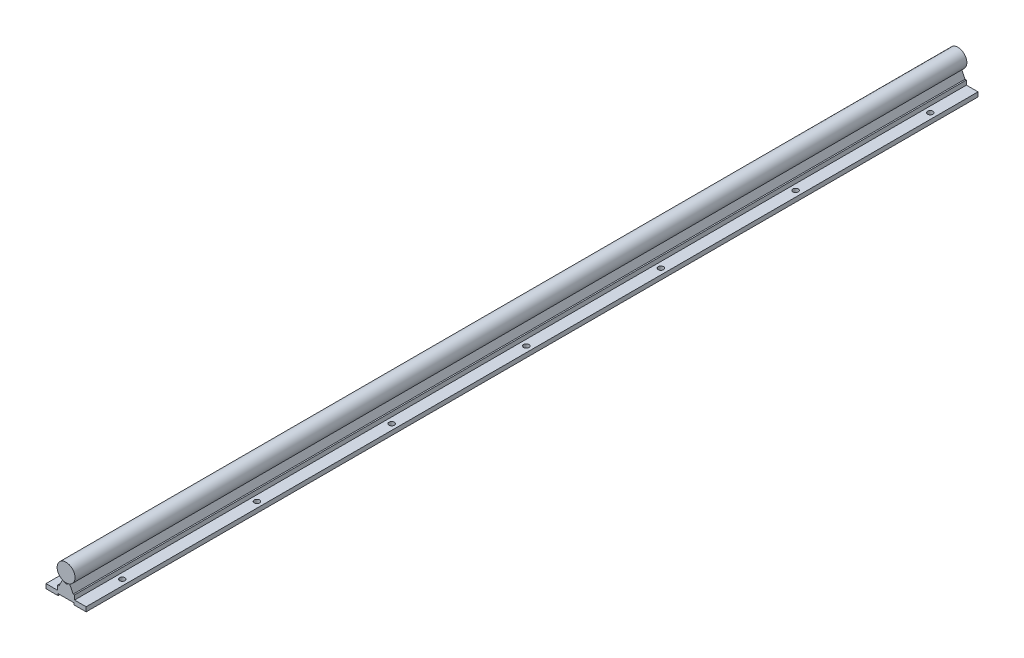
ISO-10303-21;
HEADER;
FILE_DESCRIPTION(('STEP AP214'),'2;1');
FILE_NAME('part.step','',(''),(''),'','','');
FILE_SCHEMA(('AUTOMOTIVE_DESIGN { 1 0 10303 214 1 1 1 1 }'));
ENDSEC;
DATA;
#1=APPLICATION_CONTEXT('core data for automotive mechanical design processes');
#2=APPLICATION_PROTOCOL_DEFINITION('international standard','automotive_design',2000,#1);
#3=PRODUCT_CONTEXT('',#1,'mechanical');
#4=PRODUCT('Part','Part','',(#3));
#5=PRODUCT_RELATED_PRODUCT_CATEGORY('part','',(#4));
#6=PRODUCT_DEFINITION_FORMATION('','',#4);
#7=PRODUCT_DEFINITION_CONTEXT('part definition',#1,'design');
#8=PRODUCT_DEFINITION('design','',#6,#7);
#9=PRODUCT_DEFINITION_SHAPE('','',#8);
#10=(LENGTH_UNIT() NAMED_UNIT(*) SI_UNIT(.MILLI.,.METRE.));
#11=(NAMED_UNIT(*) PLANE_ANGLE_UNIT() SI_UNIT($,.RADIAN.));
#12=(NAMED_UNIT(*) SI_UNIT($,.STERADIAN.) SOLID_ANGLE_UNIT());
#13=UNCERTAINTY_MEASURE_WITH_UNIT(LENGTH_MEASURE(1.E-05),#10,'distance_accuracy_value','');
#14=(GEOMETRIC_REPRESENTATION_CONTEXT(3) GLOBAL_UNCERTAINTY_ASSIGNED_CONTEXT((#13)) GLOBAL_UNIT_ASSIGNED_CONTEXT((#10,
#11,#12)) REPRESENTATION_CONTEXT('',''));
#15=CARTESIAN_POINT('',(0.,0.,0.));
#16=DIRECTION('',(0.,0.,1.));
#17=DIRECTION('',(1.,0.,0.));
#18=AXIS2_PLACEMENT_3D('',#15,#16,#17);
#19=CARTESIAN_POINT('',(0.,-27.,-1000.));
#20=DIRECTION('',(0.,-1.,0.));
#21=DIRECTION('',(0.,0.,-1.));
#22=AXIS2_PLACEMENT_3D('',#19,#20,#21);
#23=PLANE('',#22);
#24=CARTESIAN_POINT('',(-15.999999999998,-27.,-802.));
#25=DIRECTION('',(0.,-1.,0.));
#26=DIRECTION('',(0.,0.,-1.));
#27=AXIS2_PLACEMENT_3D('',#24,#25,#26);
#28=CIRCLE('',#27,3.);
#29=CARTESIAN_POINT('',(-15.999999999998,-27.,-805.));
#30=VERTEX_POINT('',#29);
#31=EDGE_CURVE('E758',#30,#30,#28,.F.);
#32=ORIENTED_EDGE('',*,*,#31,.T.);
#33=EDGE_LOOP('',(#32));
#34=FACE_BOUND('',#33,.T.);
#35=CARTESIAN_POINT('',(-15.9999999999991,-27.,-500.));
#36=DIRECTION('',(0.,-1.,0.));
#37=DIRECTION('',(0.,0.,-1.));
#38=AXIS2_PLACEMENT_3D('',#35,#36,#37);
#39=CIRCLE('',#38,3.);
#40=CARTESIAN_POINT('',(-15.9999999999991,-27.,-503.));
#41=VERTEX_POINT('',#40);
#42=EDGE_CURVE('E769',#41,#41,#39,.F.);
#43=ORIENTED_EDGE('',*,*,#42,.T.);
#44=EDGE_LOOP('',(#43));
#45=FACE_BOUND('',#44,.T.);
#46=CARTESIAN_POINT('',(-16.0000000000001,-27.,-198.));
#47=DIRECTION('',(0.,-1.,0.));
#48=DIRECTION('',(0.,0.,-1.));
#49=AXIS2_PLACEMENT_3D('',#46,#47,#48);
#50=CIRCLE('',#49,3.);
#51=CARTESIAN_POINT('',(-16.0000000000001,-27.,-201.));
#52=VERTEX_POINT('',#51);
#53=EDGE_CURVE('E781',#52,#52,#50,.F.);
#54=ORIENTED_EDGE('',*,*,#53,.T.);
#55=EDGE_LOOP('',(#54));
#56=FACE_BOUND('',#55,.T.);
#57=DIRECTION('',(1.,0.,0.));
#58=VECTOR('',#57,1.);
#59=CARTESIAN_POINT('',(0.,-27.,0.));
#60=LINE('',#59,#58);
#61=CARTESIAN_POINT('',(-22.5,-27.,0.));
#62=VERTEX_POINT('',#61);
#63=CARTESIAN_POINT('',(-9.,-27.,0.));
#64=VERTEX_POINT('',#63);
#65=EDGE_CURVE('E269',#62,#64,#60,.T.);
#66=ORIENTED_EDGE('',*,*,#65,.F.);
#67=DIRECTION('',(0.,0.,1.));
#68=VECTOR('',#67,1.);
#69=CARTESIAN_POINT('',(-22.5,-27.,-1000.));
#70=LINE('',#69,#68);
#71=CARTESIAN_POINT('',(-22.5,-27.,-1000.));
#72=VERTEX_POINT('',#71);
#73=EDGE_CURVE('E310',#72,#62,#70,.T.);
#74=ORIENTED_EDGE('',*,*,#73,.F.);
#75=DIRECTION('',(1.,0.,0.));
#76=VECTOR('',#75,1.);
#77=CARTESIAN_POINT('',(0.,-27.,-1000.));
#78=LINE('',#77,#76);
#79=CARTESIAN_POINT('',(-9.,-27.,-1000.));
#80=VERTEX_POINT('',#79);
#81=EDGE_CURVE('E382',#72,#80,#78,.T.);
#82=ORIENTED_EDGE('',*,*,#81,.T.);
#83=DIRECTION('',(0.,0.,1.));
#84=VECTOR('',#83,1.);
#85=CARTESIAN_POINT('',(-9.,-27.,-1000.));
#86=LINE('',#85,#84);
#87=EDGE_CURVE('E308',#80,#64,#86,.T.);
#88=ORIENTED_EDGE('',*,*,#87,.T.);
#89=EDGE_LOOP('',(#66,#74,#82,#88));
#90=FACE_BOUND('',#89,.T.);
#91=CARTESIAN_POINT('',(-16.0000000000001,-27.,-47.));
#92=DIRECTION('',(0.,-1.,0.));
#93=DIRECTION('',(0.,0.,-1.));
#94=AXIS2_PLACEMENT_3D('',#91,#92,#93);
#95=CIRCLE('',#94,2.99999999999999);
#96=CARTESIAN_POINT('',(-16.0000000000001,-27.,-50.));
#97=VERTEX_POINT('',#96);
#98=EDGE_CURVE('E786',#97,#97,#95,.F.);
#99=ORIENTED_EDGE('',*,*,#98,.T.);
#100=EDGE_LOOP('',(#99));
#101=FACE_BOUND('',#100,.T.);
#102=CARTESIAN_POINT('',(-15.9999999999996,-27.,-349.));
#103=DIRECTION('',(0.,-1.,0.));
#104=DIRECTION('',(0.,0.,-1.));
#105=AXIS2_PLACEMENT_3D('',#102,#103,#104);
#106=CIRCLE('',#105,3.);
#107=CARTESIAN_POINT('',(-15.9999999999996,-27.,-352.));
#108=VERTEX_POINT('',#107);
#109=EDGE_CURVE('E775',#108,#108,#106,.F.);
#110=ORIENTED_EDGE('',*,*,#109,.T.);
#111=EDGE_LOOP('',(#110));
#112=FACE_BOUND('',#111,.T.);
#113=CARTESIAN_POINT('',(-15.9999999999985,-27.,-651.));
#114=DIRECTION('',(0.,-1.,0.));
#115=DIRECTION('',(0.,0.,-1.));
#116=AXIS2_PLACEMENT_3D('',#113,#114,#115);
#117=CIRCLE('',#116,3.);
#118=CARTESIAN_POINT('',(-15.9999999999985,-27.,-654.));
#119=VERTEX_POINT('',#118);
#120=EDGE_CURVE('E763',#119,#119,#117,.F.);
#121=ORIENTED_EDGE('',*,*,#120,.T.);
#122=EDGE_LOOP('',(#121));
#123=FACE_BOUND('',#122,.T.);
#124=CARTESIAN_POINT('',(-15.9999999999975,-27.,-953.));
#125=DIRECTION('',(0.,-1.,0.));
#126=DIRECTION('',(0.,0.,-1.));
#127=AXIS2_PLACEMENT_3D('',#124,#125,#126);
#128=CIRCLE('',#127,3.);
#129=CARTESIAN_POINT('',(-15.9999999999975,-27.,-956.));
#130=VERTEX_POINT('',#129);
#131=EDGE_CURVE('E747',#130,#130,#128,.F.);
#132=ORIENTED_EDGE('',*,*,#131,.T.);
#133=EDGE_LOOP('',(#132));
#134=FACE_BOUND('',#133,.T.);
#135=ADVANCED_FACE('F100',(#34,#45,#56,#90,#101,#112,#123,#134),#23,.T.);
#136=CARTESIAN_POINT('',(0.,-22.,-1000.));
#137=DIRECTION('',(0.,-1.,0.));
#138=DIRECTION('',(1.,0.,0.));
#139=AXIS2_PLACEMENT_3D('',#136,#137,#138);
#140=PLANE('',#139);
#141=CARTESIAN_POINT('',(-15.999999999998,-22.,-802.));
#142=DIRECTION('',(0.,-1.,0.));
#143=DIRECTION('',(1.,0.,0.));
#144=AXIS2_PLACEMENT_3D('',#141,#142,#143);
#145=CIRCLE('',#144,3.);
#146=CARTESIAN_POINT('',(-12.999999999998,-22.,-802.));
#147=VERTEX_POINT('',#146);
#148=EDGE_CURVE('E753',#147,#147,#145,.T.);
#149=ORIENTED_EDGE('',*,*,#148,.T.);
#150=EDGE_LOOP('',(#149));
#151=FACE_BOUND('',#150,.T.);
#152=CARTESIAN_POINT('',(-15.999999999999,-22.,-500.));
#153=DIRECTION('',(0.,-1.,0.));
#154=DIRECTION('',(1.,0.,0.));
#155=AXIS2_PLACEMENT_3D('',#152,#153,#154);
#156=CIRCLE('',#155,3.);
#157=CARTESIAN_POINT('',(-12.999999999999,-22.,-500.));
#158=VERTEX_POINT('',#157);
#159=EDGE_CURVE('E766',#158,#158,#156,.T.);
#160=ORIENTED_EDGE('',*,*,#159,.T.);
#161=EDGE_LOOP('',(#160));
#162=FACE_BOUND('',#161,.T.);
#163=CARTESIAN_POINT('',(-16.0000000000001,-22.,-198.));
#164=DIRECTION('',(0.,-1.,0.));
#165=DIRECTION('',(1.,0.,0.));
#166=AXIS2_PLACEMENT_3D('',#163,#164,#165);
#167=CIRCLE('',#166,3.);
#168=CARTESIAN_POINT('',(-13.0000000000001,-22.,-198.));
#169=VERTEX_POINT('',#168);
#170=EDGE_CURVE('E778',#169,#169,#167,.T.);
#171=ORIENTED_EDGE('',*,*,#170,.T.);
#172=EDGE_LOOP('',(#171));
#173=FACE_BOUND('',#172,.T.);
#174=DIRECTION('',(1.,0.,0.));
#175=VECTOR('',#174,1.);
#176=CARTESIAN_POINT('',(0.,-22.,0.));
#177=LINE('',#176,#175);
#178=CARTESIAN_POINT('',(-22.5,-22.,0.));
#179=VERTEX_POINT('',#178);
#180=CARTESIAN_POINT('',(-9.5,-22.,0.));
#181=VERTEX_POINT('',#180);
#182=EDGE_CURVE('E265',#179,#181,#177,.T.);
#183=ORIENTED_EDGE('',*,*,#182,.T.);
#184=DIRECTION('',(0.,0.,1.));
#185=VECTOR('',#184,1.);
#186=CARTESIAN_POINT('',(-9.5,-22.,-1000.));
#187=LINE('',#186,#185);
#188=CARTESIAN_POINT('',(-9.5,-22.,-1000.));
#189=VERTEX_POINT('',#188);
#190=EDGE_CURVE('E315',#189,#181,#187,.T.);
#191=ORIENTED_EDGE('',*,*,#190,.F.);
#192=DIRECTION('',(1.,0.,0.));
#193=VECTOR('',#192,1.);
#194=CARTESIAN_POINT('',(0.,-22.,-1000.));
#195=LINE('',#194,#193);
#196=CARTESIAN_POINT('',(-22.5,-22.,-1000.));
#197=VERTEX_POINT('',#196);
#198=EDGE_CURVE('E378',#197,#189,#195,.T.);
#199=ORIENTED_EDGE('',*,*,#198,.F.);
#200=DIRECTION('',(0.,0.,1.));
#201=VECTOR('',#200,1.);
#202=CARTESIAN_POINT('',(-22.5,-22.,-1000.));
#203=LINE('',#202,#201);
#204=EDGE_CURVE('E312',#197,#179,#203,.T.);
#205=ORIENTED_EDGE('',*,*,#204,.T.);
#206=EDGE_LOOP('',(#183,#191,#199,#205));
#207=FACE_BOUND('',#206,.T.);
#208=CARTESIAN_POINT('',(-16.0000000000001,-22.,-47.));
#209=DIRECTION('',(0.,-1.,0.));
#210=DIRECTION('',(1.,0.,0.));
#211=AXIS2_PLACEMENT_3D('',#208,#209,#210);
#212=CIRCLE('',#211,2.99999999999999);
#213=CARTESIAN_POINT('',(-13.0000000000001,-22.,-47.));
#214=VERTEX_POINT('',#213);
#215=EDGE_CURVE('E784',#214,#214,#212,.T.);
#216=ORIENTED_EDGE('',*,*,#215,.T.);
#217=EDGE_LOOP('',(#216));
#218=FACE_BOUND('',#217,.T.);
#219=CARTESIAN_POINT('',(-15.9999999999996,-22.,-349.));
#220=DIRECTION('',(0.,-1.,0.));
#221=DIRECTION('',(1.,0.,0.));
#222=AXIS2_PLACEMENT_3D('',#219,#220,#221);
#223=CIRCLE('',#222,3.);
#224=CARTESIAN_POINT('',(-12.9999999999996,-22.,-349.));
#225=VERTEX_POINT('',#224);
#226=EDGE_CURVE('E772',#225,#225,#223,.T.);
#227=ORIENTED_EDGE('',*,*,#226,.T.);
#228=EDGE_LOOP('',(#227));
#229=FACE_BOUND('',#228,.T.);
#230=CARTESIAN_POINT('',(-15.9999999999985,-22.,-651.));
#231=DIRECTION('',(0.,-1.,0.));
#232=DIRECTION('',(1.,0.,0.));
#233=AXIS2_PLACEMENT_3D('',#230,#231,#232);
#234=CIRCLE('',#233,3.);
#235=CARTESIAN_POINT('',(-12.9999999999985,-22.,-651.));
#236=VERTEX_POINT('',#235);
#237=EDGE_CURVE('E760',#236,#236,#234,.T.);
#238=ORIENTED_EDGE('',*,*,#237,.T.);
#239=EDGE_LOOP('',(#238));
#240=FACE_BOUND('',#239,.T.);
#241=CARTESIAN_POINT('',(-15.9999999999975,-22.,-953.));
#242=DIRECTION('',(0.,-1.,0.));
#243=DIRECTION('',(1.,0.,0.));
#244=AXIS2_PLACEMENT_3D('',#241,#242,#243);
#245=CIRCLE('',#244,3.);
#246=CARTESIAN_POINT('',(-12.9999999999975,-22.,-953.));
#247=VERTEX_POINT('',#246);
#248=EDGE_CURVE('E750',#247,#247,#245,.T.);
#249=ORIENTED_EDGE('',*,*,#248,.T.);
#250=EDGE_LOOP('',(#249));
#251=FACE_BOUND('',#250,.T.);
#252=ADVANCED_FACE('F432',(#151,#162,#173,#207,#218,#229,#240,#251),#140,.F.);
#253=CARTESIAN_POINT('',(4.16867439026003,-9.08777839728015,-1000.));
#254=DIRECTION('',(0.41693923720368,-0.908934360930433,0.));
#255=DIRECTION('',(0.908934360930433,0.41693923720368,0.));
#256=AXIS2_PLACEMENT_3D('',#253,#254,#255);
#257=PLANE('',#256);
#258=DIRECTION('',(0.908934360930433,0.41693923720368,0.));
#259=VECTOR('',#258,1.);
#260=CARTESIAN_POINT('',(4.16867439026003,-9.08777839728015,0.));
#261=LINE('',#260,#259);
#262=CARTESIAN_POINT('',(0.,-11.,0.));
#263=VERTEX_POINT('',#262);
#264=CARTESIAN_POINT('',(4.,-9.16515138991168,0.));
#265=VERTEX_POINT('',#264);
#266=EDGE_CURVE('E252',#263,#265,#261,.T.);
#267=ORIENTED_EDGE('',*,*,#266,.T.);
#268=DIRECTION('',(0.,0.,1.));
#269=VECTOR('',#268,1.);
#270=CARTESIAN_POINT('',(4.,-9.16515138991168,-1000.));
#271=LINE('',#270,#269);
#272=CARTESIAN_POINT('',(4.,-9.16515138991168,-1000.));
#273=VERTEX_POINT('',#272);
#274=EDGE_CURVE('E13',#273,#265,#271,.T.);
#275=ORIENTED_EDGE('',*,*,#274,.F.);
#276=DIRECTION('',(0.908934360930433,0.41693923720368,0.));
#277=VECTOR('',#276,1.);
#278=CARTESIAN_POINT('',(4.16867439026003,-9.08777839728015,-1000.));
#279=LINE('',#278,#277);
#280=CARTESIAN_POINT('',(0.,-11.,-1000.));
#281=VERTEX_POINT('',#280);
#282=EDGE_CURVE('E119',#281,#273,#279,.T.);
#283=ORIENTED_EDGE('',*,*,#282,.F.);
#284=DIRECTION('',(0.,0.,1.));
#285=VECTOR('',#284,1.);
#286=CARTESIAN_POINT('',(0.,-11.,-1000.));
#287=LINE('',#286,#285);
#288=EDGE_CURVE('E251',#281,#263,#287,.T.);
#289=ORIENTED_EDGE('',*,*,#288,.T.);
#290=EDGE_LOOP('',(#267,#275,#283,#289));
#291=FACE_BOUND('',#290,.T.);
#292=ADVANCED_FACE('F102',(#291),#257,.F.);
#293=CARTESIAN_POINT('',(-0.538747339617475,-0.275051818575676,-1000.));
#294=DIRECTION('',(0.89064088769949,0.454707388501512,0.));
#295=DIRECTION('',(-0.454707388501512,0.89064088769949,0.));
#296=AXIS2_PLACEMENT_3D('',#293,#294,#295);
#297=PLANE('',#296);
#298=DIRECTION('',(-0.454707388501512,0.89064088769949,0.));
#299=VECTOR('',#298,1.);
#300=CARTESIAN_POINT('',(-0.538747339617475,-0.275051818575676,0.));
#301=LINE('',#300,#299);
#302=CARTESIAN_POINT('',(8.00000000000001,-17.,0.));
#303=VERTEX_POINT('',#302);
#304=EDGE_CURVE('E292',#303,#265,#301,.T.);
#305=ORIENTED_EDGE('',*,*,#304,.F.);
#306=DIRECTION('',(0.,0.,1.));
#307=VECTOR('',#306,1.);
#308=CARTESIAN_POINT('',(8.00000000000001,-17.,-1000.));
#309=LINE('',#308,#307);
#310=CARTESIAN_POINT('',(8.00000000000001,-17.,-1000.));
#311=VERTEX_POINT('',#310);
#312=EDGE_CURVE('E110',#311,#303,#309,.T.);
#313=ORIENTED_EDGE('',*,*,#312,.F.);
#314=DIRECTION('',(-0.454707388501512,0.89064088769949,0.));
#315=VECTOR('',#314,1.);
#316=CARTESIAN_POINT('',(-0.538747339617475,-0.275051818575676,-1000.));
#317=LINE('',#316,#315);
#318=EDGE_CURVE('E231',#311,#273,#317,.T.);
#319=ORIENTED_EDGE('',*,*,#318,.T.);
#320=ORIENTED_EDGE('',*,*,#274,.T.);
#321=EDGE_LOOP('',(#305,#313,#319,#320));
#322=FACE_BOUND('',#321,.T.);
#323=ADVANCED_FACE('F451',(#322),#297,.T.);
#324=CARTESIAN_POINT('',(0.,-17.,-1000.));
#325=DIRECTION('',(0.,-1.,0.));
#326=DIRECTION('',(0.,0.,-1.));
#327=AXIS2_PLACEMENT_3D('',#324,#325,#326);
#328=PLANE('',#327);
#329=DIRECTION('',(1.,0.,0.));
#330=VECTOR('',#329,1.);
#331=CARTESIAN_POINT('',(0.,-17.,0.));
#332=LINE('',#331,#330);
#333=CARTESIAN_POINT('',(9.5,-17.,0.));
#334=VERTEX_POINT('',#333);
#335=EDGE_CURVE('E236',#303,#334,#332,.T.);
#336=ORIENTED_EDGE('',*,*,#335,.T.);
#337=DIRECTION('',(0.,0.,1.));
#338=VECTOR('',#337,1.);
#339=CARTESIAN_POINT('',(9.5,-17.,-1000.));
#340=LINE('',#339,#338);
#341=CARTESIAN_POINT('',(9.5,-17.,-1000.));
#342=VERTEX_POINT('',#341);
#343=EDGE_CURVE('E234',#342,#334,#340,.T.);
#344=ORIENTED_EDGE('',*,*,#343,.F.);
#345=DIRECTION('',(1.,0.,0.));
#346=VECTOR('',#345,1.);
#347=CARTESIAN_POINT('',(0.,-17.,-1000.));
#348=LINE('',#347,#346);
#349=EDGE_CURVE('E225',#311,#342,#348,.T.);
#350=ORIENTED_EDGE('',*,*,#349,.F.);
#351=ORIENTED_EDGE('',*,*,#312,.T.);
#352=EDGE_LOOP('',(#336,#344,#350,#351));
#353=FACE_BOUND('',#352,.T.);
#354=ADVANCED_FACE('F235',(#353),#328,.F.);
#355=CARTESIAN_POINT('',(9.49999999999999,0.,-1000.));
#356=DIRECTION('',(-1.,0.,0.));
#357=DIRECTION('',(0.,-1.,0.));
#358=AXIS2_PLACEMENT_3D('',#355,#356,#357);
#359=PLANE('',#358);
#360=DIRECTION('',(0.,-1.,0.));
#361=VECTOR('',#360,1.);
#362=CARTESIAN_POINT('',(9.49999999999999,0.,0.));
#363=LINE('',#362,#361);
#364=CARTESIAN_POINT('',(9.50000000000001,-22.,0.));
#365=VERTEX_POINT('',#364);
#366=EDGE_CURVE('E289',#334,#365,#363,.T.);
#367=ORIENTED_EDGE('',*,*,#366,.T.);
#368=DIRECTION('',(0.,0.,1.));
#369=VECTOR('',#368,1.);
#370=CARTESIAN_POINT('',(9.50000000000001,-22.,-1000.));
#371=LINE('',#370,#369);
#372=CARTESIAN_POINT('',(9.50000000000001,-22.,-1000.));
#373=VERTEX_POINT('',#372);
#374=EDGE_CURVE('E239',#373,#365,#371,.T.);
#375=ORIENTED_EDGE('',*,*,#374,.F.);
#376=DIRECTION('',(0.,-1.,0.));
#377=VECTOR('',#376,1.);
#378=CARTESIAN_POINT('',(9.49999999999999,0.,-1000.));
#379=LINE('',#378,#377);
#380=EDGE_CURVE('E229',#342,#373,#379,.T.);
#381=ORIENTED_EDGE('',*,*,#380,.F.);
#382=ORIENTED_EDGE('',*,*,#343,.T.);
#383=EDGE_LOOP('',(#367,#375,#381,#382));
#384=FACE_BOUND('',#383,.T.);
#385=ADVANCED_FACE('F241',(#384),#359,.F.);
#386=CARTESIAN_POINT('',(0.,-22.,-1000.));
#387=DIRECTION('',(0.,-1.,0.));
#388=DIRECTION('',(1.,0.,0.));
#389=AXIS2_PLACEMENT_3D('',#386,#387,#388);
#390=PLANE('',#389);
#391=CARTESIAN_POINT('',(15.9999999999975,-22.,-953.));
#392=DIRECTION('',(0.,1.,0.));
#393=DIRECTION('',(-1.,0.,0.));
#394=AXIS2_PLACEMENT_3D('',#391,#392,#393);
#395=CIRCLE('',#394,3.);
#396=CARTESIAN_POINT('',(12.9999999999975,-22.,-953.));
#397=VERTEX_POINT('',#396);
#398=EDGE_CURVE('E357',#397,#397,#395,.T.);
#399=ORIENTED_EDGE('',*,*,#398,.F.);
#400=EDGE_LOOP('',(#399));
#401=FACE_BOUND('',#400,.T.);
#402=CARTESIAN_POINT('',(15.999999999998,-22.,-802.));
#403=DIRECTION('',(0.,1.,0.));
#404=DIRECTION('',(-1.,0.,0.));
#405=AXIS2_PLACEMENT_3D('',#402,#403,#404);
#406=CIRCLE('',#405,3.);
#407=CARTESIAN_POINT('',(12.999999999998,-22.,-802.));
#408=VERTEX_POINT('',#407);
#409=EDGE_CURVE('E347',#408,#408,#406,.T.);
#410=ORIENTED_EDGE('',*,*,#409,.F.);
#411=EDGE_LOOP('',(#410));
#412=FACE_BOUND('',#411,.T.);
#413=CARTESIAN_POINT('',(15.9999999999985,-22.,-651.));
#414=DIRECTION('',(0.,1.,0.));
#415=DIRECTION('',(-1.,0.,0.));
#416=AXIS2_PLACEMENT_3D('',#413,#414,#415);
#417=CIRCLE('',#416,3.);
#418=CARTESIAN_POINT('',(12.9999999999985,-22.,-651.));
#419=VERTEX_POINT('',#418);
#420=EDGE_CURVE('E344',#419,#419,#417,.T.);
#421=ORIENTED_EDGE('',*,*,#420,.F.);
#422=EDGE_LOOP('',(#421));
#423=FACE_BOUND('',#422,.T.);
#424=CARTESIAN_POINT('',(15.999999999999,-22.,-500.));
#425=DIRECTION('',(0.,1.,0.));
#426=DIRECTION('',(-1.,0.,0.));
#427=AXIS2_PLACEMENT_3D('',#424,#425,#426);
#428=CIRCLE('',#427,3.);
#429=CARTESIAN_POINT('',(12.999999999999,-22.,-500.));
#430=VERTEX_POINT('',#429);
#431=EDGE_CURVE('E341',#430,#430,#428,.T.);
#432=ORIENTED_EDGE('',*,*,#431,.F.);
#433=EDGE_LOOP('',(#432));
#434=FACE_BOUND('',#433,.T.);
#435=CARTESIAN_POINT('',(15.9999999999996,-22.,-349.));
#436=DIRECTION('',(0.,1.,0.));
#437=DIRECTION('',(-1.,0.,0.));
#438=AXIS2_PLACEMENT_3D('',#435,#436,#437);
#439=CIRCLE('',#438,3.);
#440=CARTESIAN_POINT('',(12.9999999999996,-22.,-349.));
#441=VERTEX_POINT('',#440);
#442=EDGE_CURVE('E337',#441,#441,#439,.T.);
#443=ORIENTED_EDGE('',*,*,#442,.F.);
#444=EDGE_LOOP('',(#443));
#445=FACE_BOUND('',#444,.T.);
#446=CARTESIAN_POINT('',(16.0000000000001,-22.,-198.));
#447=DIRECTION('',(0.,1.,0.));
#448=DIRECTION('',(-1.,0.,0.));
#449=AXIS2_PLACEMENT_3D('',#446,#447,#448);
#450=CIRCLE('',#449,3.);
#451=CARTESIAN_POINT('',(13.0000000000001,-22.,-198.));
#452=VERTEX_POINT('',#451);
#453=EDGE_CURVE('E333',#452,#452,#450,.T.);
#454=ORIENTED_EDGE('',*,*,#453,.F.);
#455=EDGE_LOOP('',(#454));
#456=FACE_BOUND('',#455,.T.);
#457=CARTESIAN_POINT('',(16.0000000000001,-22.,-47.));
#458=DIRECTION('',(0.,1.,0.));
#459=DIRECTION('',(-1.,0.,0.));
#460=AXIS2_PLACEMENT_3D('',#457,#458,#459);
#461=CIRCLE('',#460,2.99999999999999);
#462=CARTESIAN_POINT('',(13.0000000000001,-22.,-47.));
#463=VERTEX_POINT('',#462);
#464=EDGE_CURVE('E329',#463,#463,#461,.T.);
#465=ORIENTED_EDGE('',*,*,#464,.F.);
#466=EDGE_LOOP('',(#465));
#467=FACE_BOUND('',#466,.T.);
#468=DIRECTION('',(1.,0.,0.));
#469=VECTOR('',#468,1.);
#470=CARTESIAN_POINT('',(0.,-22.,0.));
#471=LINE('',#470,#469);
#472=CARTESIAN_POINT('',(22.5,-22.,0.));
#473=VERTEX_POINT('',#472);
#474=EDGE_CURVE('E287',#365,#473,#471,.T.);
#475=ORIENTED_EDGE('',*,*,#474,.T.);
#476=DIRECTION('',(0.,0.,1.));
#477=VECTOR('',#476,1.);
#478=CARTESIAN_POINT('',(22.5,-22.,-1000.));
#479=LINE('',#478,#477);
#480=CARTESIAN_POINT('',(22.5,-22.,-1000.));
#481=VERTEX_POINT('',#480);
#482=EDGE_CURVE('E297',#481,#473,#479,.T.);
#483=ORIENTED_EDGE('',*,*,#482,.F.);
#484=DIRECTION('',(1.,0.,0.));
#485=VECTOR('',#484,1.);
#486=CARTESIAN_POINT('',(0.,-22.,-1000.));
#487=LINE('',#486,#485);
#488=EDGE_CURVE('E244',#373,#481,#487,.T.);
#489=ORIENTED_EDGE('',*,*,#488,.F.);
#490=ORIENTED_EDGE('',*,*,#374,.T.);
#491=EDGE_LOOP('',(#475,#483,#489,#490));
#492=FACE_BOUND('',#491,.T.);
#493=ADVANCED_FACE('F456',(#401,#412,#423,#434,#445,#456,#467,#492),#390,.F.);
#494=CARTESIAN_POINT('',(22.5,0.,-1000.));
#495=DIRECTION('',(-1.,0.,0.));
#496=DIRECTION('',(0.,0.,1.));
#497=AXIS2_PLACEMENT_3D('',#494,#495,#496);
#498=PLANE('',#497);
#499=DIRECTION('',(0.,-1.,0.));
#500=VECTOR('',#499,1.);
#501=CARTESIAN_POINT('',(22.5,0.,0.));
#502=LINE('',#501,#500);
#503=CARTESIAN_POINT('',(22.5,-27.,0.));
#504=VERTEX_POINT('',#503);
#505=EDGE_CURVE('E284',#473,#504,#502,.T.);
#506=ORIENTED_EDGE('',*,*,#505,.T.);
#507=DIRECTION('',(0.,0.,1.));
#508=VECTOR('',#507,1.);
#509=CARTESIAN_POINT('',(22.5,-27.,-1000.));
#510=LINE('',#509,#508);
#511=CARTESIAN_POINT('',(22.5,-27.,-1000.));
#512=VERTEX_POINT('',#511);
#513=EDGE_CURVE('E300',#512,#504,#510,.T.);
#514=ORIENTED_EDGE('',*,*,#513,.F.);
#515=DIRECTION('',(0.,-1.,0.));
#516=VECTOR('',#515,1.);
#517=CARTESIAN_POINT('',(22.5,0.,-1000.));
#518=LINE('',#517,#516);
#519=EDGE_CURVE('E246',#481,#512,#518,.T.);
#520=ORIENTED_EDGE('',*,*,#519,.F.);
#521=ORIENTED_EDGE('',*,*,#482,.T.);
#522=EDGE_LOOP('',(#506,#514,#520,#521));
#523=FACE_BOUND('',#522,.T.);
#524=ADVANCED_FACE('F402',(#523),#498,.F.);
#525=CARTESIAN_POINT('',(0.,-27.,-1000.));
#526=DIRECTION('',(0.,-1.,0.));
#527=DIRECTION('',(1.,0.,0.));
#528=AXIS2_PLACEMENT_3D('',#525,#526,#527);
#529=PLANE('',#528);
#530=CARTESIAN_POINT('',(15.9999999999975,-27.,-953.));
#531=DIRECTION('',(0.,-1.,0.));
#532=DIRECTION('',(1.,0.,0.));
#533=AXIS2_PLACEMENT_3D('',#530,#531,#532);
#534=CIRCLE('',#533,3.);
#535=CARTESIAN_POINT('',(18.9999999999975,-27.,-953.));
#536=VERTEX_POINT('',#535);
#537=EDGE_CURVE('E104',#536,#536,#534,.T.);
#538=ORIENTED_EDGE('',*,*,#537,.F.);
#539=EDGE_LOOP('',(#538));
#540=FACE_BOUND('',#539,.T.);
#541=CARTESIAN_POINT('',(15.999999999998,-27.,-802.));
#542=DIRECTION('',(0.,-1.,0.));
#543=DIRECTION('',(1.,0.,0.));
#544=AXIS2_PLACEMENT_3D('',#541,#542,#543);
#545=CIRCLE('',#544,3.);
#546=CARTESIAN_POINT('',(18.999999999998,-27.,-802.));
#547=VERTEX_POINT('',#546);
#548=EDGE_CURVE('E345',#547,#547,#545,.T.);
#549=ORIENTED_EDGE('',*,*,#548,.F.);
#550=EDGE_LOOP('',(#549));
#551=FACE_BOUND('',#550,.T.);
#552=CARTESIAN_POINT('',(15.9999999999985,-27.,-651.));
#553=DIRECTION('',(0.,-1.,0.));
#554=DIRECTION('',(1.,0.,0.));
#555=AXIS2_PLACEMENT_3D('',#552,#553,#554);
#556=CIRCLE('',#555,3.);
#557=CARTESIAN_POINT('',(18.9999999999985,-27.,-651.));
#558=VERTEX_POINT('',#557);
#559=EDGE_CURVE('E342',#558,#558,#556,.T.);
#560=ORIENTED_EDGE('',*,*,#559,.F.);
#561=EDGE_LOOP('',(#560));
#562=FACE_BOUND('',#561,.T.);
#563=CARTESIAN_POINT('',(15.9999999999991,-27.,-500.));
#564=DIRECTION('',(0.,-1.,0.));
#565=DIRECTION('',(1.,0.,0.));
#566=AXIS2_PLACEMENT_3D('',#563,#564,#565);
#567=CIRCLE('',#566,3.);
#568=CARTESIAN_POINT('',(18.9999999999991,-27.,-500.));
#569=VERTEX_POINT('',#568);
#570=EDGE_CURVE('E338',#569,#569,#567,.T.);
#571=ORIENTED_EDGE('',*,*,#570,.F.);
#572=EDGE_LOOP('',(#571));
#573=FACE_BOUND('',#572,.T.);
#574=CARTESIAN_POINT('',(15.9999999999996,-27.,-349.));
#575=DIRECTION('',(0.,-1.,0.));
#576=DIRECTION('',(1.,0.,0.));
#577=AXIS2_PLACEMENT_3D('',#574,#575,#576);
#578=CIRCLE('',#577,3.);
#579=CARTESIAN_POINT('',(18.9999999999996,-27.,-349.));
#580=VERTEX_POINT('',#579);
#581=EDGE_CURVE('E334',#580,#580,#578,.T.);
#582=ORIENTED_EDGE('',*,*,#581,.F.);
#583=EDGE_LOOP('',(#582));
#584=FACE_BOUND('',#583,.T.);
#585=CARTESIAN_POINT('',(16.0000000000001,-27.,-198.));
#586=DIRECTION('',(0.,-1.,0.));
#587=DIRECTION('',(1.,0.,0.));
#588=AXIS2_PLACEMENT_3D('',#585,#586,#587);
#589=CIRCLE('',#588,3.);
#590=CARTESIAN_POINT('',(19.0000000000001,-27.,-198.));
#591=VERTEX_POINT('',#590);
#592=EDGE_CURVE('E330',#591,#591,#589,.T.);
#593=ORIENTED_EDGE('',*,*,#592,.F.);
#594=EDGE_LOOP('',(#593));
#595=FACE_BOUND('',#594,.T.);
#596=CARTESIAN_POINT('',(16.0000000000001,-27.,-47.));
#597=DIRECTION('',(0.,-1.,0.));
#598=DIRECTION('',(1.,0.,0.));
#599=AXIS2_PLACEMENT_3D('',#596,#597,#598);
#600=CIRCLE('',#599,2.99999999999999);
#601=CARTESIAN_POINT('',(19.0000000000001,-27.,-47.));
#602=VERTEX_POINT('',#601);
#603=EDGE_CURVE('E255',#602,#602,#600,.T.);
#604=ORIENTED_EDGE('',*,*,#603,.F.);
#605=EDGE_LOOP('',(#604));
#606=FACE_BOUND('',#605,.T.);
#607=DIRECTION('',(1.,0.,0.));
#608=VECTOR('',#607,1.);
#609=CARTESIAN_POINT('',(0.,-27.,0.));
#610=LINE('',#609,#608);
#611=CARTESIAN_POINT('',(9.,-27.,0.));
#612=VERTEX_POINT('',#611);
#613=EDGE_CURVE('E281',#612,#504,#610,.T.);
#614=ORIENTED_EDGE('',*,*,#613,.F.);
#615=DIRECTION('',(0.,0.,1.));
#616=VECTOR('',#615,1.);
#617=CARTESIAN_POINT('',(9.,-27.,-1000.));
#618=LINE('',#617,#616);
#619=CARTESIAN_POINT('',(9.,-27.,-1000.));
#620=VERTEX_POINT('',#619);
#621=EDGE_CURVE('E302',#620,#612,#618,.T.);
#622=ORIENTED_EDGE('',*,*,#621,.F.);
#623=DIRECTION('',(1.,0.,0.));
#624=VECTOR('',#623,1.);
#625=CARTESIAN_POINT('',(0.,-27.,-1000.));
#626=LINE('',#625,#624);
#627=EDGE_CURVE('E394',#620,#512,#626,.T.);
#628=ORIENTED_EDGE('',*,*,#627,.T.);
#629=ORIENTED_EDGE('',*,*,#513,.T.);
#630=EDGE_LOOP('',(#614,#622,#628,#629));
#631=FACE_BOUND('',#630,.T.);
#632=ADVANCED_FACE('F406',(#540,#551,#562,#573,#584,#595,#606,#631),#529,.T.);
#633=CARTESIAN_POINT('',(9.,0.,-1000.));
#634=DIRECTION('',(-1.,0.,0.));
#635=DIRECTION('',(0.,0.,1.));
#636=AXIS2_PLACEMENT_3D('',#633,#634,#635);
#637=PLANE('',#636);
#638=DIRECTION('',(0.,-1.,0.));
#639=VECTOR('',#638,1.);
#640=CARTESIAN_POINT('',(9.,0.,0.));
#641=LINE('',#640,#639);
#642=CARTESIAN_POINT('',(9.,-25.,0.));
#643=VERTEX_POINT('',#642);
#644=EDGE_CURVE('E278',#643,#612,#641,.T.);
#645=ORIENTED_EDGE('',*,*,#644,.F.);
#646=DIRECTION('',(0.,0.,1.));
#647=VECTOR('',#646,1.);
#648=CARTESIAN_POINT('',(9.,-25.,-1000.));
#649=LINE('',#648,#647);
#650=CARTESIAN_POINT('',(9.,-25.,-1000.));
#651=VERTEX_POINT('',#650);
#652=EDGE_CURVE('E304',#651,#643,#649,.T.);
#653=ORIENTED_EDGE('',*,*,#652,.F.);
#654=DIRECTION('',(0.,-1.,0.));
#655=VECTOR('',#654,1.);
#656=CARTESIAN_POINT('',(9.,0.,-1000.));
#657=LINE('',#656,#655);
#658=EDGE_CURVE('E391',#651,#620,#657,.T.);
#659=ORIENTED_EDGE('',*,*,#658,.T.);
#660=ORIENTED_EDGE('',*,*,#621,.T.);
#661=EDGE_LOOP('',(#645,#653,#659,#660));
#662=FACE_BOUND('',#661,.T.);
#663=ADVANCED_FACE('F409',(#662),#637,.T.);
#664=CARTESIAN_POINT('',(0.,-25.,-1000.));
#665=DIRECTION('',(0.,-1.,0.));
#666=DIRECTION('',(1.,0.,0.));
#667=AXIS2_PLACEMENT_3D('',#664,#665,#666);
#668=PLANE('',#667);
#669=DIRECTION('',(1.,0.,0.));
#670=VECTOR('',#669,1.);
#671=CARTESIAN_POINT('',(0.,-25.,0.));
#672=LINE('',#671,#670);
#673=CARTESIAN_POINT('',(-9.,-25.,0.));
#674=VERTEX_POINT('',#673);
#675=EDGE_CURVE('E275',#674,#643,#672,.T.);
#676=ORIENTED_EDGE('',*,*,#675,.F.);
#677=DIRECTION('',(0.,0.,1.));
#678=VECTOR('',#677,1.);
#679=CARTESIAN_POINT('',(-9.,-25.,-1000.));
#680=LINE('',#679,#678);
#681=CARTESIAN_POINT('',(-9.,-25.,-1000.));
#682=VERTEX_POINT('',#681);
#683=EDGE_CURVE('E306',#682,#674,#680,.T.);
#684=ORIENTED_EDGE('',*,*,#683,.F.);
#685=DIRECTION('',(1.,0.,0.));
#686=VECTOR('',#685,1.);
#687=CARTESIAN_POINT('',(0.,-25.,-1000.));
#688=LINE('',#687,#686);
#689=EDGE_CURVE('E388',#682,#651,#688,.T.);
#690=ORIENTED_EDGE('',*,*,#689,.T.);
#691=ORIENTED_EDGE('',*,*,#652,.T.);
#692=EDGE_LOOP('',(#676,#684,#690,#691));
#693=FACE_BOUND('',#692,.T.);
#694=ADVANCED_FACE('F414',(#693),#668,.T.);
#695=CARTESIAN_POINT('',(-9.,0.,-1000.));
#696=DIRECTION('',(1.,0.,0.));
#697=DIRECTION('',(0.,0.,-1.));
#698=AXIS2_PLACEMENT_3D('',#695,#696,#697);
#699=PLANE('',#698);
#700=DIRECTION('',(0.,1.,0.));
#701=VECTOR('',#700,1.);
#702=CARTESIAN_POINT('',(-9.,0.,0.));
#703=LINE('',#702,#701);
#704=EDGE_CURVE('E272',#64,#674,#703,.T.);
#705=ORIENTED_EDGE('',*,*,#704,.F.);
#706=ORIENTED_EDGE('',*,*,#87,.F.);
#707=DIRECTION('',(0.,1.,0.));
#708=VECTOR('',#707,1.);
#709=CARTESIAN_POINT('',(-9.,0.,-1000.));
#710=LINE('',#709,#708);
#711=EDGE_CURVE('E385',#80,#682,#710,.T.);
#712=ORIENTED_EDGE('',*,*,#711,.T.);
#713=ORIENTED_EDGE('',*,*,#683,.T.);
#714=EDGE_LOOP('',(#705,#706,#712,#713));
#715=FACE_BOUND('',#714,.T.);
#716=ADVANCED_FACE('F417',(#715),#699,.T.);
#717=CARTESIAN_POINT('',(-22.5,0.,-1000.));
#718=DIRECTION('',(1.,0.,0.));
#719=DIRECTION('',(0.,0.,-1.));
#720=AXIS2_PLACEMENT_3D('',#717,#718,#719);
#721=PLANE('',#720);
#722=DIRECTION('',(0.,1.,0.));
#723=VECTOR('',#722,1.);
#724=CARTESIAN_POINT('',(-22.5,0.,0.));
#725=LINE('',#724,#723);
#726=EDGE_CURVE('E267',#62,#179,#725,.T.);
#727=ORIENTED_EDGE('',*,*,#726,.T.);
#728=ORIENTED_EDGE('',*,*,#204,.F.);
#729=DIRECTION('',(0.,1.,0.));
#730=VECTOR('',#729,1.);
#731=CARTESIAN_POINT('',(-22.5,0.,-1000.));
#732=LINE('',#731,#730);
#733=EDGE_CURVE('E380',#72,#197,#732,.T.);
#734=ORIENTED_EDGE('',*,*,#733,.F.);
#735=ORIENTED_EDGE('',*,*,#73,.T.);
#736=EDGE_LOOP('',(#727,#728,#734,#735));
#737=FACE_BOUND('',#736,.T.);
#738=ADVANCED_FACE('F426',(#737),#721,.F.);
#739=CARTESIAN_POINT('',(-9.5,0.,-1000.));
#740=DIRECTION('',(1.,0.,0.));
#741=DIRECTION('',(0.,0.,-1.));
#742=AXIS2_PLACEMENT_3D('',#739,#740,#741);
#743=PLANE('',#742);
#744=DIRECTION('',(0.,1.,0.));
#745=VECTOR('',#744,1.);
#746=CARTESIAN_POINT('',(-9.5,0.,0.));
#747=LINE('',#746,#745);
#748=CARTESIAN_POINT('',(-9.5,-17.,0.));
#749=VERTEX_POINT('',#748);
#750=EDGE_CURVE('E263',#181,#749,#747,.T.);
#751=ORIENTED_EDGE('',*,*,#750,.T.);
#752=DIRECTION('',(0.,0.,1.));
#753=VECTOR('',#752,1.);
#754=CARTESIAN_POINT('',(-9.5,-17.,-1000.));
#755=LINE('',#754,#753);
#756=CARTESIAN_POINT('',(-9.5,-17.,-1000.));
#757=VERTEX_POINT('',#756);
#758=EDGE_CURVE('E318',#757,#749,#755,.T.);
#759=ORIENTED_EDGE('',*,*,#758,.F.);
#760=DIRECTION('',(0.,1.,0.));
#761=VECTOR('',#760,1.);
#762=CARTESIAN_POINT('',(-9.5,0.,-1000.));
#763=LINE('',#762,#761);
#764=EDGE_CURVE('E376',#189,#757,#763,.T.);
#765=ORIENTED_EDGE('',*,*,#764,.F.);
#766=ORIENTED_EDGE('',*,*,#190,.T.);
#767=EDGE_LOOP('',(#751,#759,#765,#766));
#768=FACE_BOUND('',#767,.T.);
#769=ADVANCED_FACE('F437',(#768),#743,.F.);
#770=CARTESIAN_POINT('',(0.,-17.,-1000.));
#771=DIRECTION('',(0.,-1.,0.));
#772=DIRECTION('',(0.,0.,-1.));
#773=AXIS2_PLACEMENT_3D('',#770,#771,#772);
#774=PLANE('',#773);
#775=DIRECTION('',(1.,0.,0.));
#776=VECTOR('',#775,1.);
#777=CARTESIAN_POINT('',(0.,-17.,0.));
#778=LINE('',#777,#776);
#779=CARTESIAN_POINT('',(-8.,-17.,0.));
#780=VERTEX_POINT('',#779);
#781=EDGE_CURVE('E260',#749,#780,#778,.T.);
#782=ORIENTED_EDGE('',*,*,#781,.T.);
#783=DIRECTION('',(0.,0.,1.));
#784=VECTOR('',#783,1.);
#785=CARTESIAN_POINT('',(-8.,-17.,-1000.));
#786=LINE('',#785,#784);
#787=CARTESIAN_POINT('',(-8.,-17.,-1000.));
#788=VERTEX_POINT('',#787);
#789=EDGE_CURVE('E321',#788,#780,#786,.T.);
#790=ORIENTED_EDGE('',*,*,#789,.F.);
#791=DIRECTION('',(1.,0.,0.));
#792=VECTOR('',#791,1.);
#793=CARTESIAN_POINT('',(0.,-17.,-1000.));
#794=LINE('',#793,#792);
#795=EDGE_CURVE('E374',#757,#788,#794,.T.);
#796=ORIENTED_EDGE('',*,*,#795,.F.);
#797=ORIENTED_EDGE('',*,*,#758,.T.);
#798=EDGE_LOOP('',(#782,#790,#796,#797));
#799=FACE_BOUND('',#798,.T.);
#800=ADVANCED_FACE('F442',(#799),#774,.F.);
#801=CARTESIAN_POINT('',(0.538747339617475,-0.275051818575676,-1000.));
#802=DIRECTION('',(-0.89064088769949,0.454707388501512,0.));
#803=DIRECTION('',(-0.454707388501512,-0.89064088769949,0.));
#804=AXIS2_PLACEMENT_3D('',#801,#802,#803);
#805=PLANE('',#804);
#806=DIRECTION('',(-0.454707388501512,-0.89064088769949,0.));
#807=VECTOR('',#806,1.);
#808=CARTESIAN_POINT('',(0.538747339617475,-0.275051818575676,0.));
#809=LINE('',#808,#807);
#810=CARTESIAN_POINT('',(-4.,-9.16515138991168,0.));
#811=VERTEX_POINT('',#810);
#812=EDGE_CURVE('E257',#811,#780,#809,.T.);
#813=ORIENTED_EDGE('',*,*,#812,.F.);
#814=DIRECTION('',(0.,0.,1.));
#815=VECTOR('',#814,1.);
#816=CARTESIAN_POINT('',(-4.,-9.16515138991168,-1000.));
#817=LINE('',#816,#815);
#818=CARTESIAN_POINT('',(-4.,-9.16515138991168,-1000.));
#819=VERTEX_POINT('',#818);
#820=EDGE_CURVE('E323',#819,#811,#817,.T.);
#821=ORIENTED_EDGE('',*,*,#820,.F.);
#822=DIRECTION('',(-0.454707388501512,-0.89064088769949,0.));
#823=VECTOR('',#822,1.);
#824=CARTESIAN_POINT('',(0.538747339617475,-0.275051818575676,-1000.));
#825=LINE('',#824,#823);
#826=EDGE_CURVE('E371',#819,#788,#825,.T.);
#827=ORIENTED_EDGE('',*,*,#826,.T.);
#828=ORIENTED_EDGE('',*,*,#789,.T.);
#829=EDGE_LOOP('',(#813,#821,#827,#828));
#830=FACE_BOUND('',#829,.T.);
#831=ADVANCED_FACE('F445',(#830),#805,.T.);
#832=CARTESIAN_POINT('',(-4.16867439026003,-9.08777839728015,-1000.));
#833=DIRECTION('',(-0.416939237203679,-0.908934360930433,0.));
#834=DIRECTION('',(0.908934360930433,-0.41693923720368,0.));
#835=AXIS2_PLACEMENT_3D('',#832,#833,#834);
#836=PLANE('',#835);
#837=DIRECTION('',(0.908934360930433,-0.41693923720368,0.));
#838=VECTOR('',#837,1.);
#839=CARTESIAN_POINT('',(-4.16867439026003,-9.08777839728015,0.));
#840=LINE('',#839,#838);
#841=EDGE_CURVE('E254',#811,#263,#840,.T.);
#842=ORIENTED_EDGE('',*,*,#841,.T.);
#843=ORIENTED_EDGE('',*,*,#288,.F.);
#844=DIRECTION('',(0.908934360930433,-0.41693923720368,0.));
#845=VECTOR('',#844,1.);
#846=CARTESIAN_POINT('',(-4.16867439026003,-9.08777839728015,-1000.));
#847=LINE('',#846,#845);
#848=EDGE_CURVE('E184',#819,#281,#847,.T.);
#849=ORIENTED_EDGE('',*,*,#848,.F.);
#850=ORIENTED_EDGE('',*,*,#820,.T.);
#851=EDGE_LOOP('',(#842,#843,#849,#850));
#852=FACE_BOUND('',#851,.T.);
#853=ADVANCED_FACE('F448',(#852),#836,.F.);
#854=CARTESIAN_POINT('',(0.,0.,-1000.));
#855=DIRECTION('',(0.,0.,1.));
#856=DIRECTION('',(1.,0.,0.));
#857=AXIS2_PLACEMENT_3D('',#854,#855,#856);
#858=PLANE('',#857);
#859=ORIENTED_EDGE('',*,*,#282,.T.);
#860=ORIENTED_EDGE('',*,*,#318,.F.);
#861=ORIENTED_EDGE('',*,*,#349,.T.);
#862=ORIENTED_EDGE('',*,*,#380,.T.);
#863=ORIENTED_EDGE('',*,*,#488,.T.);
#864=ORIENTED_EDGE('',*,*,#519,.T.);
#865=ORIENTED_EDGE('',*,*,#627,.F.);
#866=ORIENTED_EDGE('',*,*,#658,.F.);
#867=ORIENTED_EDGE('',*,*,#689,.F.);
#868=ORIENTED_EDGE('',*,*,#711,.F.);
#869=ORIENTED_EDGE('',*,*,#81,.F.);
#870=ORIENTED_EDGE('',*,*,#733,.T.);
#871=ORIENTED_EDGE('',*,*,#198,.T.);
#872=ORIENTED_EDGE('',*,*,#764,.T.);
#873=ORIENTED_EDGE('',*,*,#795,.T.);
#874=ORIENTED_EDGE('',*,*,#826,.F.);
#875=ORIENTED_EDGE('',*,*,#848,.T.);
#876=EDGE_LOOP('',(#859,#860,#861,#862,#863,#864,#865,#866,#867,#868,#869,#870,#871,#872,#873,
#874,#875));
#877=FACE_BOUND('',#876,.T.);
#878=ADVANCED_FACE('F227',(#877),#858,.F.);
#879=CARTESIAN_POINT('',(0.,0.,0.));
#880=DIRECTION('',(0.,0.,1.));
#881=DIRECTION('',(1.,0.,0.));
#882=AXIS2_PLACEMENT_3D('',#879,#880,#881);
#883=PLANE('',#882);
#884=ORIENTED_EDGE('',*,*,#266,.F.);
#885=ORIENTED_EDGE('',*,*,#841,.F.);
#886=ORIENTED_EDGE('',*,*,#812,.T.);
#887=ORIENTED_EDGE('',*,*,#781,.F.);
#888=ORIENTED_EDGE('',*,*,#750,.F.);
#889=ORIENTED_EDGE('',*,*,#182,.F.);
#890=ORIENTED_EDGE('',*,*,#726,.F.);
#891=ORIENTED_EDGE('',*,*,#65,.T.);
#892=ORIENTED_EDGE('',*,*,#704,.T.);
#893=ORIENTED_EDGE('',*,*,#675,.T.);
#894=ORIENTED_EDGE('',*,*,#644,.T.);
#895=ORIENTED_EDGE('',*,*,#613,.T.);
#896=ORIENTED_EDGE('',*,*,#505,.F.);
#897=ORIENTED_EDGE('',*,*,#474,.F.);
#898=ORIENTED_EDGE('',*,*,#366,.F.);
#899=ORIENTED_EDGE('',*,*,#335,.F.);
#900=ORIENTED_EDGE('',*,*,#304,.T.);
#901=EDGE_LOOP('',(#884,#885,#886,#887,#888,#889,#890,#891,#892,#893,#894,#895,#896,#897,#898,
#899,#900));
#902=FACE_BOUND('',#901,.T.);
#903=ADVANCED_FACE('F453',(#902),#883,.T.);
#904=CARTESIAN_POINT('',(16.0000000000007,-1022.,-47.));
#905=DIRECTION('',(0.,1.,0.));
#906=DIRECTION('',(-1.,0.,0.));
#907=AXIS2_PLACEMENT_3D('',#904,#905,#906);
#908=CYLINDRICAL_SURFACE('',#907,2.99999999999999);
#909=ORIENTED_EDGE('',*,*,#603,.T.);
#910=EDGE_LOOP('',(#909));
#911=FACE_BOUND('',#910,.T.);
#912=ORIENTED_EDGE('',*,*,#464,.T.);
#913=EDGE_LOOP('',(#912));
#914=FACE_BOUND('',#913,.T.);
#915=ADVANCED_FACE('F496',(#911,#914),#908,.F.);
#916=CARTESIAN_POINT('',(16.0000000000006,-1022.,-198.));
#917=DIRECTION('',(0.,1.,0.));
#918=DIRECTION('',(-1.,0.,0.));
#919=AXIS2_PLACEMENT_3D('',#916,#917,#918);
#920=CYLINDRICAL_SURFACE('',#919,3.);
#921=ORIENTED_EDGE('',*,*,#592,.T.);
#922=EDGE_LOOP('',(#921));
#923=FACE_BOUND('',#922,.T.);
#924=ORIENTED_EDGE('',*,*,#453,.T.);
#925=EDGE_LOOP('',(#924));
#926=FACE_BOUND('',#925,.T.);
#927=ADVANCED_FACE('F603',(#923,#926),#920,.F.);
#928=CARTESIAN_POINT('',(16.0000000000001,-1022.,-349.));
#929=DIRECTION('',(0.,1.,0.));
#930=DIRECTION('',(-1.,0.,0.));
#931=AXIS2_PLACEMENT_3D('',#928,#929,#930);
#932=CYLINDRICAL_SURFACE('',#931,3.);
#933=ORIENTED_EDGE('',*,*,#581,.T.);
#934=EDGE_LOOP('',(#933));
#935=FACE_BOUND('',#934,.T.);
#936=ORIENTED_EDGE('',*,*,#442,.T.);
#937=EDGE_LOOP('',(#936));
#938=FACE_BOUND('',#937,.T.);
#939=ADVANCED_FACE('F612',(#935,#938),#932,.F.);
#940=CARTESIAN_POINT('',(15.9999999999996,-1022.,-500.));
#941=DIRECTION('',(0.,1.,0.));
#942=DIRECTION('',(-1.,0.,0.));
#943=AXIS2_PLACEMENT_3D('',#940,#941,#942);
#944=CYLINDRICAL_SURFACE('',#943,3.);
#945=ORIENTED_EDGE('',*,*,#570,.T.);
#946=EDGE_LOOP('',(#945));
#947=FACE_BOUND('',#946,.T.);
#948=ORIENTED_EDGE('',*,*,#431,.T.);
#949=EDGE_LOOP('',(#948));
#950=FACE_BOUND('',#949,.T.);
#951=ADVANCED_FACE('F621',(#947,#950),#944,.F.);
#952=CARTESIAN_POINT('',(15.9999999999991,-1022.,-651.));
#953=DIRECTION('',(0.,1.,0.));
#954=DIRECTION('',(-1.,0.,0.));
#955=AXIS2_PLACEMENT_3D('',#952,#953,#954);
#956=CYLINDRICAL_SURFACE('',#955,3.);
#957=ORIENTED_EDGE('',*,*,#559,.T.);
#958=EDGE_LOOP('',(#957));
#959=FACE_BOUND('',#958,.T.);
#960=ORIENTED_EDGE('',*,*,#420,.T.);
#961=EDGE_LOOP('',(#960));
#962=FACE_BOUND('',#961,.T.);
#963=ADVANCED_FACE('F631',(#959,#962),#956,.F.);
#964=CARTESIAN_POINT('',(15.9999999999985,-1022.,-802.));
#965=DIRECTION('',(0.,1.,0.));
#966=DIRECTION('',(-1.,0.,0.));
#967=AXIS2_PLACEMENT_3D('',#964,#965,#966);
#968=CYLINDRICAL_SURFACE('',#967,3.);
#969=ORIENTED_EDGE('',*,*,#548,.T.);
#970=EDGE_LOOP('',(#969));
#971=FACE_BOUND('',#970,.T.);
#972=ORIENTED_EDGE('',*,*,#409,.T.);
#973=EDGE_LOOP('',(#972));
#974=FACE_BOUND('',#973,.T.);
#975=ADVANCED_FACE('F641',(#971,#974),#968,.F.);
#976=CARTESIAN_POINT('',(15.999999999998,-1022.,-953.));
#977=DIRECTION('',(0.,1.,0.));
#978=DIRECTION('',(-1.,0.,0.));
#979=AXIS2_PLACEMENT_3D('',#976,#977,#978);
#980=CYLINDRICAL_SURFACE('',#979,3.);
#981=ORIENTED_EDGE('',*,*,#537,.T.);
#982=EDGE_LOOP('',(#981));
#983=FACE_BOUND('',#982,.T.);
#984=ORIENTED_EDGE('',*,*,#398,.T.);
#985=EDGE_LOOP('',(#984));
#986=FACE_BOUND('',#985,.T.);
#987=ADVANCED_FACE('F651',(#983,#986),#980,.F.);
#988=CARTESIAN_POINT('',(-16.0000000000007,-1022.,-47.));
#989=DIRECTION('',(0.,1.,0.));
#990=DIRECTION('',(-1.,0.,0.));
#991=AXIS2_PLACEMENT_3D('',#988,#989,#990);
#992=CYLINDRICAL_SURFACE('',#991,2.99999999999999);
#993=ORIENTED_EDGE('',*,*,#98,.F.);
#994=EDGE_LOOP('',(#993));
#995=FACE_BOUND('',#994,.T.);
#996=ORIENTED_EDGE('',*,*,#215,.F.);
#997=EDGE_LOOP('',(#996));
#998=FACE_BOUND('',#997,.T.);
#999=ADVANCED_FACE('F659',(#995,#998),#992,.F.);
#1000=CARTESIAN_POINT('',(-16.0000000000006,-1022.,-198.));
#1001=DIRECTION('',(0.,1.,0.));
#1002=DIRECTION('',(-1.,0.,0.));
#1003=AXIS2_PLACEMENT_3D('',#1000,#1001,#1002);
#1004=CYLINDRICAL_SURFACE('',#1003,3.);
#1005=ORIENTED_EDGE('',*,*,#53,.F.);
#1006=EDGE_LOOP('',(#1005));
#1007=FACE_BOUND('',#1006,.T.);
#1008=ORIENTED_EDGE('',*,*,#170,.F.);
#1009=EDGE_LOOP('',(#1008));
#1010=FACE_BOUND('',#1009,.T.);
#1011=ADVANCED_FACE('F680',(#1007,#1010),#1004,.F.);
#1012=CARTESIAN_POINT('',(-16.0000000000001,-1022.,-349.));
#1013=DIRECTION('',(0.,1.,0.));
#1014=DIRECTION('',(-1.,0.,0.));
#1015=AXIS2_PLACEMENT_3D('',#1012,#1013,#1014);
#1016=CYLINDRICAL_SURFACE('',#1015,3.);
#1017=ORIENTED_EDGE('',*,*,#109,.F.);
#1018=EDGE_LOOP('',(#1017));
#1019=FACE_BOUND('',#1018,.T.);
#1020=ORIENTED_EDGE('',*,*,#226,.F.);
#1021=EDGE_LOOP('',(#1020));
#1022=FACE_BOUND('',#1021,.T.);
#1023=ADVANCED_FACE('F690',(#1019,#1022),#1016,.F.);
#1024=CARTESIAN_POINT('',(-15.9999999999996,-1022.,-500.));
#1025=DIRECTION('',(0.,1.,0.));
#1026=DIRECTION('',(-1.,0.,0.));
#1027=AXIS2_PLACEMENT_3D('',#1024,#1025,#1026);
#1028=CYLINDRICAL_SURFACE('',#1027,3.);
#1029=ORIENTED_EDGE('',*,*,#42,.F.);
#1030=EDGE_LOOP('',(#1029));
#1031=FACE_BOUND('',#1030,.T.);
#1032=ORIENTED_EDGE('',*,*,#159,.F.);
#1033=EDGE_LOOP('',(#1032));
#1034=FACE_BOUND('',#1033,.T.);
#1035=ADVANCED_FACE('F700',(#1031,#1034),#1028,.F.);
#1036=CARTESIAN_POINT('',(-15.9999999999991,-1022.,-651.));
#1037=DIRECTION('',(0.,1.,0.));
#1038=DIRECTION('',(-1.,0.,0.));
#1039=AXIS2_PLACEMENT_3D('',#1036,#1037,#1038);
#1040=CYLINDRICAL_SURFACE('',#1039,3.);
#1041=ORIENTED_EDGE('',*,*,#120,.F.);
#1042=EDGE_LOOP('',(#1041));
#1043=FACE_BOUND('',#1042,.T.);
#1044=ORIENTED_EDGE('',*,*,#237,.F.);
#1045=EDGE_LOOP('',(#1044));
#1046=FACE_BOUND('',#1045,.T.);
#1047=ADVANCED_FACE('F710',(#1043,#1046),#1040,.F.);
#1048=CARTESIAN_POINT('',(-15.9999999999985,-1022.,-802.));
#1049=DIRECTION('',(0.,1.,0.));
#1050=DIRECTION('',(-1.,0.,0.));
#1051=AXIS2_PLACEMENT_3D('',#1048,#1049,#1050);
#1052=CYLINDRICAL_SURFACE('',#1051,3.);
#1053=ORIENTED_EDGE('',*,*,#31,.F.);
#1054=EDGE_LOOP('',(#1053));
#1055=FACE_BOUND('',#1054,.T.);
#1056=ORIENTED_EDGE('',*,*,#148,.F.);
#1057=EDGE_LOOP('',(#1056));
#1058=FACE_BOUND('',#1057,.T.);
#1059=ADVANCED_FACE('F720',(#1055,#1058),#1052,.F.);
#1060=CARTESIAN_POINT('',(-15.999999999998,-1022.,-953.));
#1061=DIRECTION('',(0.,1.,0.));
#1062=DIRECTION('',(-1.,0.,0.));
#1063=AXIS2_PLACEMENT_3D('',#1060,#1061,#1062);
#1064=CYLINDRICAL_SURFACE('',#1063,3.);
#1065=ORIENTED_EDGE('',*,*,#131,.F.);
#1066=EDGE_LOOP('',(#1065));
#1067=FACE_BOUND('',#1066,.T.);
#1068=ORIENTED_EDGE('',*,*,#248,.F.);
#1069=EDGE_LOOP('',(#1068));
#1070=FACE_BOUND('',#1069,.T.);
#1071=ADVANCED_FACE('F730',(#1067,#1070),#1064,.F.);
#1072=CLOSED_SHELL('',(#135,#252,#292,#323,#354,#385,#493,#524,#632,#663,#694,#716,#738,#769,
#800,#831,#853,#878,#903,#915,#927,#939,#951,#963,#975,#987,#999,#1011,#1023,#1035,#1047,#1059,#1071));
#1073=MANIFOLD_SOLID_BREP('B2',#1072);
#1074=CARTESIAN_POINT('',(0.,0.,-1000.));
#1075=DIRECTION('',(0.,0.,1.));
#1076=DIRECTION('',(1.,0.,0.));
#1077=AXIS2_PLACEMENT_3D('',#1074,#1075,#1076);
#1078=CYLINDRICAL_SURFACE('',#1077,10.);
#1079=CARTESIAN_POINT('',(0.,0.,-1000.));
#1080=DIRECTION('',(0.,0.,1.));
#1081=DIRECTION('',(1.,0.,0.));
#1082=AXIS2_PLACEMENT_3D('',#1079,#1080,#1081);
#1083=CIRCLE('',#1082,10.);
#1084=CARTESIAN_POINT('',(10.,0.,-1000.));
#1085=VERTEX_POINT('',#1084);
#1086=EDGE_CURVE('E99',#1085,#1085,#1083,.T.);
#1087=ORIENTED_EDGE('',*,*,#1086,.T.);
#1088=EDGE_LOOP('',(#1087));
#1089=FACE_BOUND('',#1088,.T.);
#1090=CARTESIAN_POINT('',(0.,0.,0.));
#1091=DIRECTION('',(0.,0.,1.));
#1092=DIRECTION('',(1.,0.,0.));
#1093=AXIS2_PLACEMENT_3D('',#1090,#1091,#1092);
#1094=CIRCLE('',#1093,10.);
#1095=CARTESIAN_POINT('',(10.,0.,0.));
#1096=VERTEX_POINT('',#1095);
#1097=EDGE_CURVE('E864',#1096,#1096,#1094,.T.);
#1098=ORIENTED_EDGE('',*,*,#1097,.F.);
#1099=EDGE_LOOP('',(#1098));
#1100=FACE_BOUND('',#1099,.T.);
#1101=ADVANCED_FACE('F861',(#1089,#1100),#1078,.T.);
#1102=CARTESIAN_POINT('',(0.,0.,-1000.));
#1103=DIRECTION('',(0.,0.,1.));
#1104=DIRECTION('',(1.,0.,0.));
#1105=AXIS2_PLACEMENT_3D('',#1102,#1103,#1104);
#1106=PLANE('',#1105);
#1107=ORIENTED_EDGE('',*,*,#1086,.F.);
#1108=EDGE_LOOP('',(#1107));
#1109=FACE_BOUND('',#1108,.T.);
#1110=ADVANCED_FACE('F876',(#1109),#1106,.F.);
#1111=CARTESIAN_POINT('',(0.,0.,0.));
#1112=DIRECTION('',(0.,0.,1.));
#1113=DIRECTION('',(1.,0.,0.));
#1114=AXIS2_PLACEMENT_3D('',#1111,#1112,#1113);
#1115=PLANE('',#1114);
#1116=ORIENTED_EDGE('',*,*,#1097,.T.);
#1117=EDGE_LOOP('',(#1116));
#1118=FACE_BOUND('',#1117,.T.);
#1119=ADVANCED_FACE('F873',(#1118),#1115,.T.);
#1120=CLOSED_SHELL('',(#1101,#1110,#1119));
#1121=MANIFOLD_SOLID_BREP('B7',#1120);
#1122=ADVANCED_BREP_SHAPE_REPRESENTATION('',(#18,#1073,#1121),#14);
#1123=SHAPE_DEFINITION_REPRESENTATION(#9,#1122);
ENDSEC;
END-ISO-10303-21;
